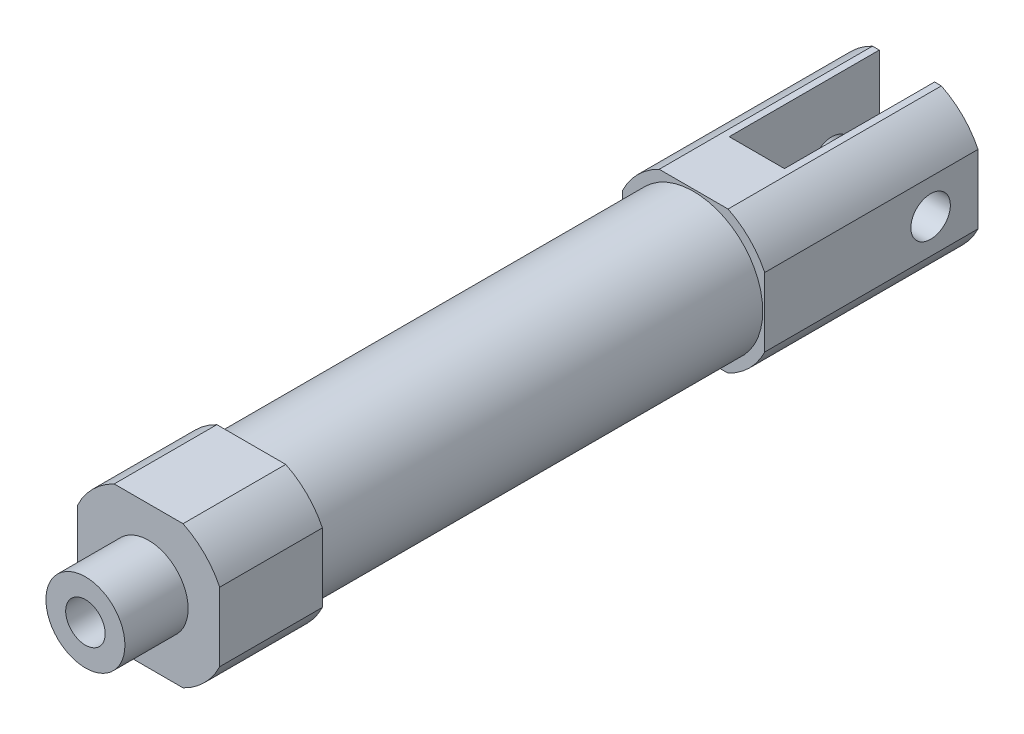
ISO-10303-21;
HEADER;
FILE_DESCRIPTION(('STEP AP214'),'2;1');
FILE_NAME('part.step','',(''),(''),'','','');
FILE_SCHEMA(('AUTOMOTIVE_DESIGN { 1 0 10303 214 1 1 1 1 }'));
ENDSEC;
DATA;
#1=APPLICATION_CONTEXT('core data for automotive mechanical design processes');
#2=APPLICATION_PROTOCOL_DEFINITION('international standard','automotive_design',2000,#1);
#3=PRODUCT_CONTEXT('',#1,'mechanical');
#4=PRODUCT('Part','Part','',(#3));
#5=PRODUCT_RELATED_PRODUCT_CATEGORY('part','',(#4));
#6=PRODUCT_DEFINITION_FORMATION('','',#4);
#7=PRODUCT_DEFINITION_CONTEXT('part definition',#1,'design');
#8=PRODUCT_DEFINITION('design','',#6,#7);
#9=PRODUCT_DEFINITION_SHAPE('','',#8);
#10=(LENGTH_UNIT() NAMED_UNIT(*) SI_UNIT(.MILLI.,.METRE.));
#11=(NAMED_UNIT(*) PLANE_ANGLE_UNIT() SI_UNIT($,.RADIAN.));
#12=(NAMED_UNIT(*) SI_UNIT($,.STERADIAN.) SOLID_ANGLE_UNIT());
#13=UNCERTAINTY_MEASURE_WITH_UNIT(LENGTH_MEASURE(1.E-05),#10,'distance_accuracy_value','');
#14=(GEOMETRIC_REPRESENTATION_CONTEXT(3) GLOBAL_UNCERTAINTY_ASSIGNED_CONTEXT((#13)) GLOBAL_UNIT_ASSIGNED_CONTEXT((#10,
#11,#12)) REPRESENTATION_CONTEXT('',''));
#15=CARTESIAN_POINT('',(0.,0.,0.));
#16=DIRECTION('',(0.,0.,1.));
#17=DIRECTION('',(1.,0.,0.));
#18=AXIS2_PLACEMENT_3D('',#15,#16,#17);
#19=CARTESIAN_POINT('',(0.,-22.1414213562373,0.));
#20=DIRECTION('',(0.,0.,1.));
#21=DIRECTION('',(1.,0.,0.));
#22=AXIS2_PLACEMENT_3D('',#19,#20,#21);
#23=PLANE('',#22);
#24=DIRECTION('',(1.,0.,0.));
#25=VECTOR('',#24,1.);
#26=CARTESIAN_POINT('',(0.,-9.,0.));
#27=LINE('',#26,#25);
#28=CARTESIAN_POINT('',(3.5,-9.,0.));
#29=VERTEX_POINT('',#28);
#30=CARTESIAN_POINT('',(4.35889894354066,-9.,0.));
#31=VERTEX_POINT('',#30);
#32=EDGE_CURVE('E168',#29,#31,#27,.T.);
#33=ORIENTED_EDGE('',*,*,#32,.F.);
#34=DIRECTION('',(0.,1.,0.));
#35=VECTOR('',#34,1.);
#36=CARTESIAN_POINT('',(3.5,-9.001,0.));
#37=LINE('',#36,#35);
#38=CARTESIAN_POINT('',(3.5,9.,0.));
#39=VERTEX_POINT('',#38);
#40=EDGE_CURVE('E192',#29,#39,#37,.T.);
#41=ORIENTED_EDGE('',*,*,#40,.T.);
#42=DIRECTION('',(1.,0.,0.));
#43=VECTOR('',#42,1.);
#44=CARTESIAN_POINT('',(0.,9.,0.));
#45=LINE('',#44,#43);
#46=CARTESIAN_POINT('',(4.35889894354067,9.,0.));
#47=VERTEX_POINT('',#46);
#48=EDGE_CURVE('E158',#39,#47,#45,.T.);
#49=ORIENTED_EDGE('',*,*,#48,.T.);
#50=CARTESIAN_POINT('',(0.,0.,0.));
#51=DIRECTION('',(0.,0.,1.));
#52=DIRECTION('',(1.,0.,0.));
#53=AXIS2_PLACEMENT_3D('',#50,#51,#52);
#54=CIRCLE('',#53,10.);
#55=CARTESIAN_POINT('',(9.,4.35889894354067,0.));
#56=VERTEX_POINT('',#55);
#57=EDGE_CURVE('E154',#56,#47,#54,.T.);
#58=ORIENTED_EDGE('',*,*,#57,.F.);
#59=DIRECTION('',(0.,1.,0.));
#60=VECTOR('',#59,1.);
#61=CARTESIAN_POINT('',(9.,-22.1414213562373,0.));
#62=LINE('',#61,#60);
#63=CARTESIAN_POINT('',(9.,-4.35889894354067,0.));
#64=VERTEX_POINT('',#63);
#65=EDGE_CURVE('E151',#64,#56,#62,.T.);
#66=ORIENTED_EDGE('',*,*,#65,.F.);
#67=EDGE_CURVE('E96',#31,#64,#54,.T.);
#68=ORIENTED_EDGE('',*,*,#67,.F.);
#69=EDGE_LOOP('',(#33,#41,#49,#58,#66,#68));
#70=FACE_BOUND('',#69,.T.);
#71=ADVANCED_FACE('F38',(#70),#23,.F.);
#72=CARTESIAN_POINT('',(0.,-22.1414213562373,96.));
#73=DIRECTION('',(0.,0.,1.));
#74=DIRECTION('',(1.,0.,0.));
#75=AXIS2_PLACEMENT_3D('',#72,#73,#74);
#76=PLANE('',#75);
#77=DIRECTION('',(0.,1.,0.));
#78=VECTOR('',#77,1.);
#79=CARTESIAN_POINT('',(9.00000000000001,-22.1414213562373,96.));
#80=LINE('',#79,#78);
#81=CARTESIAN_POINT('',(9.,-4.35889894354068,96.));
#82=VERTEX_POINT('',#81);
#83=CARTESIAN_POINT('',(9.,4.35889894354068,96.));
#84=VERTEX_POINT('',#83);
#85=EDGE_CURVE('E227',#82,#84,#80,.T.);
#86=ORIENTED_EDGE('',*,*,#85,.T.);
#87=CARTESIAN_POINT('',(0.,0.,96.));
#88=DIRECTION('',(0.,0.,1.));
#89=DIRECTION('',(1.,0.,0.));
#90=AXIS2_PLACEMENT_3D('',#87,#88,#89);
#91=CIRCLE('',#90,10.);
#92=CARTESIAN_POINT('',(4.35889894354068,9.,96.));
#93=VERTEX_POINT('',#92);
#94=EDGE_CURVE('E230',#84,#93,#91,.T.);
#95=ORIENTED_EDGE('',*,*,#94,.T.);
#96=DIRECTION('',(1.,0.,0.));
#97=VECTOR('',#96,1.);
#98=CARTESIAN_POINT('',(0.,9.,96.));
#99=LINE('',#98,#97);
#100=CARTESIAN_POINT('',(-4.35889894354068,9.,96.));
#101=VERTEX_POINT('',#100);
#102=EDGE_CURVE('E234',#101,#93,#99,.T.);
#103=ORIENTED_EDGE('',*,*,#102,.F.);
#104=CARTESIAN_POINT('',(-9.,4.35889894354068,96.));
#105=VERTEX_POINT('',#104);
#106=EDGE_CURVE('E236',#101,#105,#91,.T.);
#107=ORIENTED_EDGE('',*,*,#106,.T.);
#108=DIRECTION('',(0.,1.,0.));
#109=VECTOR('',#108,1.);
#110=CARTESIAN_POINT('',(-8.99999999999999,-22.1414213562373,96.));
#111=LINE('',#110,#109);
#112=CARTESIAN_POINT('',(-9.,-4.35889894354068,96.));
#113=VERTEX_POINT('',#112);
#114=EDGE_CURVE('E239',#113,#105,#111,.T.);
#115=ORIENTED_EDGE('',*,*,#114,.F.);
#116=CARTESIAN_POINT('',(-4.35889894354068,-9.,96.));
#117=VERTEX_POINT('',#116);
#118=EDGE_CURVE('E242',#113,#117,#91,.T.);
#119=ORIENTED_EDGE('',*,*,#118,.T.);
#120=DIRECTION('',(1.,0.,0.));
#121=VECTOR('',#120,1.);
#122=CARTESIAN_POINT('',(0.,-9.,96.));
#123=LINE('',#122,#121);
#124=CARTESIAN_POINT('',(4.35889894354068,-9.,96.));
#125=VERTEX_POINT('',#124);
#126=EDGE_CURVE('E243',#117,#125,#123,.T.);
#127=ORIENTED_EDGE('',*,*,#126,.T.);
#128=EDGE_CURVE('E235',#125,#82,#91,.T.);
#129=ORIENTED_EDGE('',*,*,#128,.T.);
#130=EDGE_LOOP('',(#86,#95,#103,#107,#115,#119,#127,#129));
#131=FACE_BOUND('',#130,.T.);
#132=CARTESIAN_POINT('',(0.,0.,96.));
#133=DIRECTION('',(0.,0.,1.));
#134=DIRECTION('',(1.,0.,0.));
#135=AXIS2_PLACEMENT_3D('',#132,#133,#134);
#136=CIRCLE('',#135,5.);
#137=CARTESIAN_POINT('',(5.,0.,96.));
#138=VERTEX_POINT('',#137);
#139=EDGE_CURVE('E219',#138,#138,#136,.T.);
#140=ORIENTED_EDGE('',*,*,#139,.F.);
#141=EDGE_LOOP('',(#140));
#142=FACE_BOUND('',#141,.T.);
#143=ADVANCED_FACE('F350',(#131,#142),#76,.T.);
#144=CARTESIAN_POINT('',(0.,-22.1414213562373,27.));
#145=DIRECTION('',(0.,0.,1.));
#146=DIRECTION('',(1.,0.,0.));
#147=AXIS2_PLACEMENT_3D('',#144,#145,#146);
#148=PLANE('',#147);
#149=DIRECTION('',(0.,1.,0.));
#150=VECTOR('',#149,1.);
#151=CARTESIAN_POINT('',(9.,-22.1414213562373,27.));
#152=LINE('',#151,#150);
#153=CARTESIAN_POINT('',(9.,-4.35889894354067,27.));
#154=VERTEX_POINT('',#153);
#155=CARTESIAN_POINT('',(9.,4.35889894354067,27.));
#156=VERTEX_POINT('',#155);
#157=EDGE_CURVE('E291',#154,#156,#152,.T.);
#158=ORIENTED_EDGE('',*,*,#157,.T.);
#159=CARTESIAN_POINT('',(0.,0.,27.));
#160=DIRECTION('',(0.,0.,1.));
#161=DIRECTION('',(1.,0.,0.));
#162=AXIS2_PLACEMENT_3D('',#159,#160,#161);
#163=CIRCLE('',#162,10.);
#164=CARTESIAN_POINT('',(4.35889894354067,9.,27.));
#165=VERTEX_POINT('',#164);
#166=EDGE_CURVE('E104',#156,#165,#163,.T.);
#167=ORIENTED_EDGE('',*,*,#166,.T.);
#168=DIRECTION('',(1.,0.,0.));
#169=VECTOR('',#168,1.);
#170=CARTESIAN_POINT('',(0.,9.,27.));
#171=LINE('',#170,#169);
#172=CARTESIAN_POINT('',(-4.35889894354067,9.,27.));
#173=VERTEX_POINT('',#172);
#174=EDGE_CURVE('E184',#173,#165,#171,.T.);
#175=ORIENTED_EDGE('',*,*,#174,.F.);
#176=CARTESIAN_POINT('',(-9.,4.35889894354067,27.));
#177=VERTEX_POINT('',#176);
#178=EDGE_CURVE('E132',#173,#177,#163,.T.);
#179=ORIENTED_EDGE('',*,*,#178,.T.);
#180=DIRECTION('',(0.,1.,0.));
#181=VECTOR('',#180,1.);
#182=CARTESIAN_POINT('',(-8.99999999999999,-22.1414213562373,27.));
#183=LINE('',#182,#181);
#184=CARTESIAN_POINT('',(-9.,-4.35889894354067,27.));
#185=VERTEX_POINT('',#184);
#186=EDGE_CURVE('E129',#185,#177,#183,.T.);
#187=ORIENTED_EDGE('',*,*,#186,.F.);
#188=CARTESIAN_POINT('',(-4.35889894354067,-9.,27.));
#189=VERTEX_POINT('',#188);
#190=EDGE_CURVE('E121',#185,#189,#163,.T.);
#191=ORIENTED_EDGE('',*,*,#190,.T.);
#192=DIRECTION('',(1.,0.,0.));
#193=VECTOR('',#192,1.);
#194=CARTESIAN_POINT('',(0.,-9.,27.));
#195=LINE('',#194,#193);
#196=CARTESIAN_POINT('',(4.35889894354066,-9.,27.));
#197=VERTEX_POINT('',#196);
#198=EDGE_CURVE('E126',#189,#197,#195,.T.);
#199=ORIENTED_EDGE('',*,*,#198,.T.);
#200=EDGE_CURVE('E63',#197,#154,#163,.T.);
#201=ORIENTED_EDGE('',*,*,#200,.T.);
#202=EDGE_LOOP('',(#158,#167,#175,#179,#187,#191,#199,#201));
#203=FACE_BOUND('',#202,.T.);
#204=CARTESIAN_POINT('',(0.,0.,27.));
#205=DIRECTION('',(0.,0.,1.));
#206=DIRECTION('',(1.,0.,0.));
#207=AXIS2_PLACEMENT_3D('',#204,#205,#206);
#208=CIRCLE('',#207,8.75);
#209=CARTESIAN_POINT('',(8.75,0.,27.));
#210=VERTEX_POINT('',#209);
#211=EDGE_CURVE('E286',#210,#210,#208,.T.);
#212=ORIENTED_EDGE('',*,*,#211,.F.);
#213=EDGE_LOOP('',(#212));
#214=FACE_BOUND('',#213,.T.);
#215=ADVANCED_FACE('F123',(#203,#214),#148,.T.);
#216=CARTESIAN_POINT('',(9.,-22.1414213562373,27.));
#217=DIRECTION('',(-1.,0.,0.));
#218=DIRECTION('',(0.,0.,1.));
#219=AXIS2_PLACEMENT_3D('',#216,#217,#218);
#220=PLANE('',#219);
#221=CARTESIAN_POINT('',(9.,0.,6.));
#222=DIRECTION('',(-1.,0.,0.));
#223=DIRECTION('',(0.,-1.,0.));
#224=AXIS2_PLACEMENT_3D('',#221,#222,#223);
#225=CIRCLE('',#224,2.5);
#226=CARTESIAN_POINT('',(9.,-2.49999999999999,6.));
#227=VERTEX_POINT('',#226);
#228=EDGE_CURVE('E327',#227,#227,#225,.T.);
#229=ORIENTED_EDGE('',*,*,#228,.T.);
#230=EDGE_LOOP('',(#229));
#231=FACE_BOUND('',#230,.T.);
#232=ORIENTED_EDGE('',*,*,#65,.T.);
#233=DIRECTION('',(0.,0.,-1.));
#234=VECTOR('',#233,1.);
#235=CARTESIAN_POINT('',(9.,4.35889894354067,27.));
#236=LINE('',#235,#234);
#237=EDGE_CURVE('E11',#156,#56,#236,.T.);
#238=ORIENTED_EDGE('',*,*,#237,.F.);
#239=ORIENTED_EDGE('',*,*,#157,.F.);
#240=DIRECTION('',(0.,0.,-1.));
#241=VECTOR('',#240,1.);
#242=CARTESIAN_POINT('',(9.,-4.35889894354067,27.));
#243=LINE('',#242,#241);
#244=EDGE_CURVE('E147',#154,#64,#243,.T.);
#245=ORIENTED_EDGE('',*,*,#244,.T.);
#246=EDGE_LOOP('',(#232,#238,#239,#245));
#247=FACE_BOUND('',#246,.T.);
#248=ADVANCED_FACE('F40',(#231,#247),#220,.F.);
#249=CARTESIAN_POINT('',(0.,0.,27.));
#250=DIRECTION('',(0.,0.,-1.));
#251=DIRECTION('',(-1.,0.,0.));
#252=AXIS2_PLACEMENT_3D('',#249,#250,#251);
#253=CYLINDRICAL_SURFACE('',#252,10.);
#254=ORIENTED_EDGE('',*,*,#57,.T.);
#255=DIRECTION('',(0.,0.,-1.));
#256=VECTOR('',#255,1.);
#257=CARTESIAN_POINT('',(4.35889894354067,9.,27.));
#258=LINE('',#257,#256);
#259=EDGE_CURVE('E47',#165,#47,#258,.T.);
#260=ORIENTED_EDGE('',*,*,#259,.F.);
#261=ORIENTED_EDGE('',*,*,#166,.F.);
#262=ORIENTED_EDGE('',*,*,#237,.T.);
#263=EDGE_LOOP('',(#254,#260,#261,#262));
#264=FACE_BOUND('',#263,.T.);
#265=ADVANCED_FACE('F185',(#264),#253,.T.);
#266=CARTESIAN_POINT('',(0.,9.,27.));
#267=DIRECTION('',(0.,1.,0.));
#268=DIRECTION('',(0.,0.,1.));
#269=AXIS2_PLACEMENT_3D('',#266,#267,#268);
#270=PLANE('',#269);
#271=DIRECTION('',(0.,0.,-1.));
#272=VECTOR('',#271,1.);
#273=CARTESIAN_POINT('',(3.5,9.,19.));
#274=LINE('',#273,#272);
#275=CARTESIAN_POINT('',(3.5,9.,19.));
#276=VERTEX_POINT('',#275);
#277=EDGE_CURVE('E211',#276,#39,#274,.T.);
#278=ORIENTED_EDGE('',*,*,#277,.F.);
#279=DIRECTION('',(1.,0.,0.));
#280=VECTOR('',#279,1.);
#281=CARTESIAN_POINT('',(-3.5,9.,19.));
#282=LINE('',#281,#280);
#283=CARTESIAN_POINT('',(-3.5,9.,19.));
#284=VERTEX_POINT('',#283);
#285=EDGE_CURVE('E311',#284,#276,#282,.T.);
#286=ORIENTED_EDGE('',*,*,#285,.F.);
#287=DIRECTION('',(0.,0.,1.));
#288=VECTOR('',#287,1.);
#289=CARTESIAN_POINT('',(-3.5,9.,0.));
#290=LINE('',#289,#288);
#291=CARTESIAN_POINT('',(-3.5,9.,0.));
#292=VERTEX_POINT('',#291);
#293=EDGE_CURVE('E308',#292,#284,#290,.T.);
#294=ORIENTED_EDGE('',*,*,#293,.F.);
#295=CARTESIAN_POINT('',(-4.35889894354067,9.,0.));
#296=VERTEX_POINT('',#295);
#297=EDGE_CURVE('E160',#296,#292,#45,.T.);
#298=ORIENTED_EDGE('',*,*,#297,.F.);
#299=DIRECTION('',(0.,0.,-1.));
#300=VECTOR('',#299,1.);
#301=CARTESIAN_POINT('',(-4.35889894354067,9.,27.));
#302=LINE('',#301,#300);
#303=EDGE_CURVE('E174',#173,#296,#302,.T.);
#304=ORIENTED_EDGE('',*,*,#303,.F.);
#305=ORIENTED_EDGE('',*,*,#174,.T.);
#306=ORIENTED_EDGE('',*,*,#259,.T.);
#307=ORIENTED_EDGE('',*,*,#48,.F.);
#308=EDGE_LOOP('',(#278,#286,#294,#298,#304,#305,#306,#307));
#309=FACE_BOUND('',#308,.T.);
#310=ADVANCED_FACE('F181',(#309),#270,.T.);
#311=CARTESIAN_POINT('',(-9.,4.35889894354067,0.));
#312=VERTEX_POINT('',#311);
#313=EDGE_CURVE('E159',#296,#312,#54,.T.);
#314=ORIENTED_EDGE('',*,*,#313,.T.);
#315=DIRECTION('',(0.,0.,-1.));
#316=VECTOR('',#315,1.);
#317=CARTESIAN_POINT('',(-9.,4.35889894354067,27.));
#318=LINE('',#317,#316);
#319=EDGE_CURVE('E172',#177,#312,#318,.T.);
#320=ORIENTED_EDGE('',*,*,#319,.F.);
#321=ORIENTED_EDGE('',*,*,#178,.F.);
#322=ORIENTED_EDGE('',*,*,#303,.T.);
#323=EDGE_LOOP('',(#314,#320,#321,#322));
#324=FACE_BOUND('',#323,.T.);
#325=ADVANCED_FACE('F302',(#324),#253,.T.);
#326=CARTESIAN_POINT('',(-8.99999999999999,-22.1414213562373,27.));
#327=DIRECTION('',(-1.,0.,0.));
#328=DIRECTION('',(0.,-1.,0.));
#329=AXIS2_PLACEMENT_3D('',#326,#327,#328);
#330=PLANE('',#329);
#331=CARTESIAN_POINT('',(-9.,0.,6.));
#332=DIRECTION('',(-1.,0.,0.));
#333=DIRECTION('',(0.,-1.,0.));
#334=AXIS2_PLACEMENT_3D('',#331,#332,#333);
#335=CIRCLE('',#334,2.5);
#336=CARTESIAN_POINT('',(-9.,-2.5,6.));
#337=VERTEX_POINT('',#336);
#338=EDGE_CURVE('E324',#337,#337,#335,.T.);
#339=ORIENTED_EDGE('',*,*,#338,.F.);
#340=EDGE_LOOP('',(#339));
#341=FACE_BOUND('',#340,.T.);
#342=DIRECTION('',(0.,1.,0.));
#343=VECTOR('',#342,1.);
#344=CARTESIAN_POINT('',(-8.99999999999999,-22.1414213562373,0.));
#345=LINE('',#344,#343);
#346=CARTESIAN_POINT('',(-9.,-4.35889894354067,0.));
#347=VERTEX_POINT('',#346);
#348=EDGE_CURVE('E163',#347,#312,#345,.T.);
#349=ORIENTED_EDGE('',*,*,#348,.F.);
#350=DIRECTION('',(0.,0.,-1.));
#351=VECTOR('',#350,1.);
#352=CARTESIAN_POINT('',(-9.,-4.35889894354067,27.));
#353=LINE('',#352,#351);
#354=EDGE_CURVE('E141',#185,#347,#353,.T.);
#355=ORIENTED_EDGE('',*,*,#354,.F.);
#356=ORIENTED_EDGE('',*,*,#186,.T.);
#357=ORIENTED_EDGE('',*,*,#319,.T.);
#358=EDGE_LOOP('',(#349,#355,#356,#357));
#359=FACE_BOUND('',#358,.T.);
#360=ADVANCED_FACE('F296',(#341,#359),#330,.T.);
#361=CARTESIAN_POINT('',(-4.35889894354067,-9.,0.));
#362=VERTEX_POINT('',#361);
#363=EDGE_CURVE('E137',#347,#362,#54,.T.);
#364=ORIENTED_EDGE('',*,*,#363,.T.);
#365=DIRECTION('',(0.,0.,-1.));
#366=VECTOR('',#365,1.);
#367=CARTESIAN_POINT('',(-4.35889894354067,-9.,27.));
#368=LINE('',#367,#366);
#369=EDGE_CURVE('E134',#189,#362,#368,.T.);
#370=ORIENTED_EDGE('',*,*,#369,.F.);
#371=ORIENTED_EDGE('',*,*,#190,.F.);
#372=ORIENTED_EDGE('',*,*,#354,.T.);
#373=EDGE_LOOP('',(#364,#370,#371,#372));
#374=FACE_BOUND('',#373,.T.);
#375=ADVANCED_FACE('F135',(#374),#253,.T.);
#376=CARTESIAN_POINT('',(0.,-9.,27.));
#377=DIRECTION('',(0.,1.,0.));
#378=DIRECTION('',(0.,0.,1.));
#379=AXIS2_PLACEMENT_3D('',#376,#377,#378);
#380=PLANE('',#379);
#381=DIRECTION('',(-1.,0.,0.));
#382=VECTOR('',#381,1.);
#383=CARTESIAN_POINT('',(-3.5,-9.,19.));
#384=LINE('',#383,#382);
#385=CARTESIAN_POINT('',(3.5,-9.,19.));
#386=VERTEX_POINT('',#385);
#387=CARTESIAN_POINT('',(-3.5,-9.,19.));
#388=VERTEX_POINT('',#387);
#389=EDGE_CURVE('E315',#386,#388,#384,.T.);
#390=ORIENTED_EDGE('',*,*,#389,.F.);
#391=DIRECTION('',(0.,0.,1.));
#392=VECTOR('',#391,1.);
#393=CARTESIAN_POINT('',(3.5,-9.,19.));
#394=LINE('',#393,#392);
#395=EDGE_CURVE('E313',#29,#386,#394,.T.);
#396=ORIENTED_EDGE('',*,*,#395,.F.);
#397=ORIENTED_EDGE('',*,*,#32,.T.);
#398=DIRECTION('',(0.,0.,-1.));
#399=VECTOR('',#398,1.);
#400=CARTESIAN_POINT('',(4.35889894354066,-9.,27.));
#401=LINE('',#400,#399);
#402=EDGE_CURVE('E142',#197,#31,#401,.T.);
#403=ORIENTED_EDGE('',*,*,#402,.F.);
#404=ORIENTED_EDGE('',*,*,#198,.F.);
#405=ORIENTED_EDGE('',*,*,#369,.T.);
#406=CARTESIAN_POINT('',(-3.5,-9.,0.));
#407=VERTEX_POINT('',#406);
#408=EDGE_CURVE('E166',#362,#407,#27,.T.);
#409=ORIENTED_EDGE('',*,*,#408,.T.);
#410=DIRECTION('',(0.,0.,-1.));
#411=VECTOR('',#410,1.);
#412=CARTESIAN_POINT('',(-3.5,-9.,0.));
#413=LINE('',#412,#411);
#414=EDGE_CURVE('E54',#388,#407,#413,.T.);
#415=ORIENTED_EDGE('',*,*,#414,.F.);
#416=EDGE_LOOP('',(#390,#396,#397,#403,#404,#405,#409,#415));
#417=FACE_BOUND('',#416,.T.);
#418=ADVANCED_FACE('F145',(#417),#380,.F.);
#419=ORIENTED_EDGE('',*,*,#67,.T.);
#420=ORIENTED_EDGE('',*,*,#244,.F.);
#421=ORIENTED_EDGE('',*,*,#200,.F.);
#422=ORIENTED_EDGE('',*,*,#402,.T.);
#423=EDGE_LOOP('',(#419,#420,#421,#422));
#424=FACE_BOUND('',#423,.T.);
#425=ADVANCED_FACE('F361',(#424),#253,.T.);
#426=ORIENTED_EDGE('',*,*,#297,.T.);
#427=DIRECTION('',(0.,1.,0.));
#428=VECTOR('',#427,1.);
#429=CARTESIAN_POINT('',(-3.5,-9.001,0.));
#430=LINE('',#429,#428);
#431=EDGE_CURVE('E216',#407,#292,#430,.T.);
#432=ORIENTED_EDGE('',*,*,#431,.F.);
#433=ORIENTED_EDGE('',*,*,#408,.F.);
#434=ORIENTED_EDGE('',*,*,#363,.F.);
#435=ORIENTED_EDGE('',*,*,#348,.T.);
#436=ORIENTED_EDGE('',*,*,#313,.F.);
#437=EDGE_LOOP('',(#426,#432,#433,#434,#435,#436));
#438=FACE_BOUND('',#437,.T.);
#439=ADVANCED_FACE('F299',(#438),#23,.F.);
#440=CARTESIAN_POINT('',(0.,0.,83.));
#441=DIRECTION('',(0.,0.,-1.));
#442=DIRECTION('',(-1.,0.,0.));
#443=AXIS2_PLACEMENT_3D('',#440,#441,#442);
#444=CYLINDRICAL_SURFACE('',#443,8.75);
#445=CARTESIAN_POINT('',(0.,0.,83.));
#446=DIRECTION('',(0.,0.,1.));
#447=DIRECTION('',(1.,0.,0.));
#448=AXIS2_PLACEMENT_3D('',#445,#446,#447);
#449=CIRCLE('',#448,8.75);
#450=CARTESIAN_POINT('',(8.75,0.,83.));
#451=VERTEX_POINT('',#450);
#452=EDGE_CURVE('E155',#451,#451,#449,.T.);
#453=ORIENTED_EDGE('',*,*,#452,.F.);
#454=EDGE_LOOP('',(#453));
#455=FACE_BOUND('',#454,.T.);
#456=ORIENTED_EDGE('',*,*,#211,.T.);
#457=EDGE_LOOP('',(#456));
#458=FACE_BOUND('',#457,.T.);
#459=ADVANCED_FACE('F360',(#455,#458),#444,.T.);
#460=CARTESIAN_POINT('',(0.,-22.1414213562373,83.));
#461=DIRECTION('',(0.,0.,1.));
#462=DIRECTION('',(1.,0.,0.));
#463=AXIS2_PLACEMENT_3D('',#460,#461,#462);
#464=PLANE('',#463);
#465=DIRECTION('',(0.,1.,0.));
#466=VECTOR('',#465,1.);
#467=CARTESIAN_POINT('',(9.00000000000001,-22.1414213562373,83.));
#468=LINE('',#467,#466);
#469=CARTESIAN_POINT('',(9.,-4.35889894354068,83.));
#470=VERTEX_POINT('',#469);
#471=CARTESIAN_POINT('',(9.,4.35889894354068,83.));
#472=VERTEX_POINT('',#471);
#473=EDGE_CURVE('E224',#470,#472,#468,.T.);
#474=ORIENTED_EDGE('',*,*,#473,.F.);
#475=CARTESIAN_POINT('',(0.,0.,83.));
#476=DIRECTION('',(0.,0.,1.));
#477=DIRECTION('',(1.,0.,0.));
#478=AXIS2_PLACEMENT_3D('',#475,#476,#477);
#479=CIRCLE('',#478,10.);
#480=CARTESIAN_POINT('',(4.35889894354068,-9.,83.));
#481=VERTEX_POINT('',#480);
#482=EDGE_CURVE('E231',#481,#470,#479,.T.);
#483=ORIENTED_EDGE('',*,*,#482,.F.);
#484=DIRECTION('',(1.,0.,0.));
#485=VECTOR('',#484,1.);
#486=CARTESIAN_POINT('',(0.,-9.,83.));
#487=LINE('',#486,#485);
#488=CARTESIAN_POINT('',(-4.35889894354068,-9.,83.));
#489=VERTEX_POINT('',#488);
#490=EDGE_CURVE('E259',#489,#481,#487,.T.);
#491=ORIENTED_EDGE('',*,*,#490,.F.);
#492=CARTESIAN_POINT('',(-9.,-4.35889894354068,83.));
#493=VERTEX_POINT('',#492);
#494=EDGE_CURVE('E258',#493,#489,#479,.T.);
#495=ORIENTED_EDGE('',*,*,#494,.F.);
#496=DIRECTION('',(0.,1.,0.));
#497=VECTOR('',#496,1.);
#498=CARTESIAN_POINT('',(-8.99999999999999,-22.1414213562373,83.));
#499=LINE('',#498,#497);
#500=CARTESIAN_POINT('',(-9.,4.35889894354068,83.));
#501=VERTEX_POINT('',#500);
#502=EDGE_CURVE('E255',#493,#501,#499,.T.);
#503=ORIENTED_EDGE('',*,*,#502,.T.);
#504=CARTESIAN_POINT('',(-4.35889894354068,9.,83.));
#505=VERTEX_POINT('',#504);
#506=EDGE_CURVE('E252',#505,#501,#479,.T.);
#507=ORIENTED_EDGE('',*,*,#506,.F.);
#508=DIRECTION('',(1.,0.,0.));
#509=VECTOR('',#508,1.);
#510=CARTESIAN_POINT('',(0.,9.,83.));
#511=LINE('',#510,#509);
#512=CARTESIAN_POINT('',(4.35889894354068,9.,83.));
#513=VERTEX_POINT('',#512);
#514=EDGE_CURVE('E251',#505,#513,#511,.T.);
#515=ORIENTED_EDGE('',*,*,#514,.T.);
#516=EDGE_CURVE('E248',#472,#513,#479,.T.);
#517=ORIENTED_EDGE('',*,*,#516,.F.);
#518=EDGE_LOOP('',(#474,#483,#491,#495,#503,#507,#515,#517));
#519=FACE_BOUND('',#518,.T.);
#520=ORIENTED_EDGE('',*,*,#452,.T.);
#521=EDGE_LOOP('',(#520));
#522=FACE_BOUND('',#521,.T.);
#523=ADVANCED_FACE('F366',(#519,#522),#464,.F.);
#524=CARTESIAN_POINT('',(9.00000000000001,-22.1414213562373,96.));
#525=DIRECTION('',(-1.,0.,0.));
#526=DIRECTION('',(0.,-1.,0.));
#527=AXIS2_PLACEMENT_3D('',#524,#525,#526);
#528=PLANE('',#527);
#529=ORIENTED_EDGE('',*,*,#473,.T.);
#530=DIRECTION('',(0.,0.,-1.));
#531=VECTOR('',#530,1.);
#532=CARTESIAN_POINT('',(9.,4.35889894354068,96.));
#533=LINE('',#532,#531);
#534=EDGE_CURVE('E283',#84,#472,#533,.T.);
#535=ORIENTED_EDGE('',*,*,#534,.F.);
#536=ORIENTED_EDGE('',*,*,#85,.F.);
#537=DIRECTION('',(0.,0.,-1.));
#538=VECTOR('',#537,1.);
#539=CARTESIAN_POINT('',(9.,-4.35889894354068,96.));
#540=LINE('',#539,#538);
#541=EDGE_CURVE('E262',#82,#470,#540,.T.);
#542=ORIENTED_EDGE('',*,*,#541,.T.);
#543=EDGE_LOOP('',(#529,#535,#536,#542));
#544=FACE_BOUND('',#543,.T.);
#545=ADVANCED_FACE('F540',(#544),#528,.F.);
#546=CARTESIAN_POINT('',(0.,0.,96.));
#547=DIRECTION('',(0.,0.,-1.));
#548=DIRECTION('',(-1.,0.,0.));
#549=AXIS2_PLACEMENT_3D('',#546,#547,#548);
#550=CYLINDRICAL_SURFACE('',#549,10.);
#551=ORIENTED_EDGE('',*,*,#516,.T.);
#552=DIRECTION('',(0.,0.,-1.));
#553=VECTOR('',#552,1.);
#554=CARTESIAN_POINT('',(4.35889894354068,9.,96.));
#555=LINE('',#554,#553);
#556=EDGE_CURVE('E280',#93,#513,#555,.T.);
#557=ORIENTED_EDGE('',*,*,#556,.F.);
#558=ORIENTED_EDGE('',*,*,#94,.F.);
#559=ORIENTED_EDGE('',*,*,#534,.T.);
#560=EDGE_LOOP('',(#551,#557,#558,#559));
#561=FACE_BOUND('',#560,.T.);
#562=ADVANCED_FACE('F549',(#561),#550,.T.);
#563=CARTESIAN_POINT('',(0.,9.,96.));
#564=DIRECTION('',(0.,1.,0.));
#565=DIRECTION('',(-1.,0.,0.));
#566=AXIS2_PLACEMENT_3D('',#563,#564,#565);
#567=PLANE('',#566);
#568=ORIENTED_EDGE('',*,*,#514,.F.);
#569=DIRECTION('',(0.,0.,-1.));
#570=VECTOR('',#569,1.);
#571=CARTESIAN_POINT('',(-4.35889894354068,9.,96.));
#572=LINE('',#571,#570);
#573=EDGE_CURVE('E277',#101,#505,#572,.T.);
#574=ORIENTED_EDGE('',*,*,#573,.F.);
#575=ORIENTED_EDGE('',*,*,#102,.T.);
#576=ORIENTED_EDGE('',*,*,#556,.T.);
#577=EDGE_LOOP('',(#568,#574,#575,#576));
#578=FACE_BOUND('',#577,.T.);
#579=ADVANCED_FACE('F558',(#578),#567,.T.);
#580=ORIENTED_EDGE('',*,*,#506,.T.);
#581=DIRECTION('',(0.,0.,-1.));
#582=VECTOR('',#581,1.);
#583=CARTESIAN_POINT('',(-9.,4.35889894354068,96.));
#584=LINE('',#583,#582);
#585=EDGE_CURVE('E274',#105,#501,#584,.T.);
#586=ORIENTED_EDGE('',*,*,#585,.F.);
#587=ORIENTED_EDGE('',*,*,#106,.F.);
#588=ORIENTED_EDGE('',*,*,#573,.T.);
#589=EDGE_LOOP('',(#580,#586,#587,#588));
#590=FACE_BOUND('',#589,.T.);
#591=ADVANCED_FACE('F561',(#590),#550,.T.);
#592=CARTESIAN_POINT('',(-8.99999999999999,-22.1414213562373,96.));
#593=DIRECTION('',(-1.,0.,0.));
#594=DIRECTION('',(0.,-1.,0.));
#595=AXIS2_PLACEMENT_3D('',#592,#593,#594);
#596=PLANE('',#595);
#597=ORIENTED_EDGE('',*,*,#502,.F.);
#598=DIRECTION('',(0.,0.,-1.));
#599=VECTOR('',#598,1.);
#600=CARTESIAN_POINT('',(-9.,-4.35889894354068,96.));
#601=LINE('',#600,#599);
#602=EDGE_CURVE('E271',#113,#493,#601,.T.);
#603=ORIENTED_EDGE('',*,*,#602,.F.);
#604=ORIENTED_EDGE('',*,*,#114,.T.);
#605=ORIENTED_EDGE('',*,*,#585,.T.);
#606=EDGE_LOOP('',(#597,#603,#604,#605));
#607=FACE_BOUND('',#606,.T.);
#608=ADVANCED_FACE('F576',(#607),#596,.T.);
#609=ORIENTED_EDGE('',*,*,#494,.T.);
#610=DIRECTION('',(0.,0.,-1.));
#611=VECTOR('',#610,1.);
#612=CARTESIAN_POINT('',(-4.35889894354068,-9.,96.));
#613=LINE('',#612,#611);
#614=EDGE_CURVE('E268',#117,#489,#613,.T.);
#615=ORIENTED_EDGE('',*,*,#614,.F.);
#616=ORIENTED_EDGE('',*,*,#118,.F.);
#617=ORIENTED_EDGE('',*,*,#602,.T.);
#618=EDGE_LOOP('',(#609,#615,#616,#617));
#619=FACE_BOUND('',#618,.T.);
#620=ADVANCED_FACE('F578',(#619),#550,.T.);
#621=CARTESIAN_POINT('',(0.,-9.,96.));
#622=DIRECTION('',(0.,1.,0.));
#623=DIRECTION('',(0.,0.,1.));
#624=AXIS2_PLACEMENT_3D('',#621,#622,#623);
#625=PLANE('',#624);
#626=ORIENTED_EDGE('',*,*,#490,.T.);
#627=DIRECTION('',(0.,0.,-1.));
#628=VECTOR('',#627,1.);
#629=CARTESIAN_POINT('',(4.35889894354068,-9.,96.));
#630=LINE('',#629,#628);
#631=EDGE_CURVE('E265',#125,#481,#630,.T.);
#632=ORIENTED_EDGE('',*,*,#631,.F.);
#633=ORIENTED_EDGE('',*,*,#126,.F.);
#634=ORIENTED_EDGE('',*,*,#614,.T.);
#635=EDGE_LOOP('',(#626,#632,#633,#634));
#636=FACE_BOUND('',#635,.T.);
#637=ADVANCED_FACE('F593',(#636),#625,.F.);
#638=ORIENTED_EDGE('',*,*,#482,.T.);
#639=ORIENTED_EDGE('',*,*,#541,.F.);
#640=ORIENTED_EDGE('',*,*,#128,.F.);
#641=ORIENTED_EDGE('',*,*,#631,.T.);
#642=EDGE_LOOP('',(#638,#639,#640,#641));
#643=FACE_BOUND('',#642,.T.);
#644=ADVANCED_FACE('F416',(#643),#550,.T.);
#645=CARTESIAN_POINT('',(0.,0.,104.));
#646=DIRECTION('',(0.,0.,-1.));
#647=DIRECTION('',(-1.,0.,0.));
#648=AXIS2_PLACEMENT_3D('',#645,#646,#647);
#649=CYLINDRICAL_SURFACE('',#648,5.);
#650=CARTESIAN_POINT('',(0.,0.,104.));
#651=DIRECTION('',(0.,0.,1.));
#652=DIRECTION('',(1.,0.,0.));
#653=AXIS2_PLACEMENT_3D('',#650,#651,#652);
#654=CIRCLE('',#653,5.);
#655=CARTESIAN_POINT('',(5.,0.,104.));
#656=VERTEX_POINT('',#655);
#657=EDGE_CURVE('E221',#656,#656,#654,.T.);
#658=ORIENTED_EDGE('',*,*,#657,.F.);
#659=EDGE_LOOP('',(#658));
#660=FACE_BOUND('',#659,.T.);
#661=ORIENTED_EDGE('',*,*,#139,.T.);
#662=EDGE_LOOP('',(#661));
#663=FACE_BOUND('',#662,.T.);
#664=ADVANCED_FACE('F420',(#660,#663),#649,.T.);
#665=CARTESIAN_POINT('',(0.,0.,104.));
#666=DIRECTION('',(0.,0.,1.));
#667=DIRECTION('',(1.,0.,0.));
#668=AXIS2_PLACEMENT_3D('',#665,#666,#667);
#669=PLANE('',#668);
#670=CARTESIAN_POINT('',(0.,0.,104.));
#671=DIRECTION('',(0.,0.,1.));
#672=DIRECTION('',(1.,0.,0.));
#673=AXIS2_PLACEMENT_3D('',#670,#671,#672);
#674=CIRCLE('',#673,2.5);
#675=CARTESIAN_POINT('',(2.5,0.,104.));
#676=VERTEX_POINT('',#675);
#677=EDGE_CURVE('E201',#676,#676,#674,.T.);
#678=ORIENTED_EDGE('',*,*,#677,.F.);
#679=EDGE_LOOP('',(#678));
#680=FACE_BOUND('',#679,.T.);
#681=ORIENTED_EDGE('',*,*,#657,.T.);
#682=EDGE_LOOP('',(#681));
#683=FACE_BOUND('',#682,.T.);
#684=ADVANCED_FACE('F424',(#680,#683),#669,.T.);
#685=CARTESIAN_POINT('',(0.,0.,74.));
#686=DIRECTION('',(0.,0.,1.));
#687=DIRECTION('',(1.,0.,0.));
#688=AXIS2_PLACEMENT_3D('',#685,#686,#687);
#689=CYLINDRICAL_SURFACE('',#688,2.5);
#690=CARTESIAN_POINT('',(0.,0.,74.));
#691=DIRECTION('',(0.,0.,1.));
#692=DIRECTION('',(1.,0.,0.));
#693=AXIS2_PLACEMENT_3D('',#690,#691,#692);
#694=CIRCLE('',#693,2.5);
#695=CARTESIAN_POINT('',(2.5,0.,74.));
#696=VERTEX_POINT('',#695);
#697=EDGE_CURVE('E205',#696,#696,#694,.T.);
#698=ORIENTED_EDGE('',*,*,#697,.F.);
#699=EDGE_LOOP('',(#698));
#700=FACE_BOUND('',#699,.T.);
#701=ORIENTED_EDGE('',*,*,#677,.T.);
#702=EDGE_LOOP('',(#701));
#703=FACE_BOUND('',#702,.T.);
#704=ADVANCED_FACE('F434',(#700,#703),#689,.F.);
#705=CARTESIAN_POINT('',(0.,0.,74.));
#706=DIRECTION('',(0.,0.,1.));
#707=DIRECTION('',(1.,0.,0.));
#708=AXIS2_PLACEMENT_3D('',#705,#706,#707);
#709=PLANE('',#708);
#710=ORIENTED_EDGE('',*,*,#697,.T.);
#711=EDGE_LOOP('',(#710));
#712=FACE_BOUND('',#711,.T.);
#713=ADVANCED_FACE('F444',(#712),#709,.T.);
#714=CARTESIAN_POINT('',(3.5,-9.001,19.));
#715=DIRECTION('',(1.,0.,0.));
#716=DIRECTION('',(0.,0.,-1.));
#717=AXIS2_PLACEMENT_3D('',#714,#715,#716);
#718=PLANE('',#717);
#719=CARTESIAN_POINT('',(3.5,0.,6.));
#720=DIRECTION('',(1.,0.,0.));
#721=DIRECTION('',(0.,0.,-1.));
#722=AXIS2_PLACEMENT_3D('',#719,#720,#721);
#723=CIRCLE('',#722,2.5);
#724=CARTESIAN_POINT('',(3.5,0.,3.5));
#725=VERTEX_POINT('',#724);
#726=EDGE_CURVE('E321',#725,#725,#723,.T.);
#727=ORIENTED_EDGE('',*,*,#726,.T.);
#728=EDGE_LOOP('',(#727));
#729=FACE_BOUND('',#728,.T.);
#730=ORIENTED_EDGE('',*,*,#395,.T.);
#731=DIRECTION('',(0.,1.,0.));
#732=VECTOR('',#731,1.);
#733=CARTESIAN_POINT('',(3.5,-9.001,19.));
#734=LINE('',#733,#732);
#735=EDGE_CURVE('E202',#386,#276,#734,.T.);
#736=ORIENTED_EDGE('',*,*,#735,.T.);
#737=ORIENTED_EDGE('',*,*,#277,.T.);
#738=ORIENTED_EDGE('',*,*,#40,.F.);
#739=EDGE_LOOP('',(#730,#736,#737,#738));
#740=FACE_BOUND('',#739,.T.);
#741=ADVANCED_FACE('F453',(#729,#740),#718,.F.);
#742=CARTESIAN_POINT('',(-3.5,-9.001,19.));
#743=DIRECTION('',(0.,0.,1.));
#744=DIRECTION('',(1.,0.,0.));
#745=AXIS2_PLACEMENT_3D('',#742,#743,#744);
#746=PLANE('',#745);
#747=ORIENTED_EDGE('',*,*,#389,.T.);
#748=DIRECTION('',(0.,1.,0.));
#749=VECTOR('',#748,1.);
#750=CARTESIAN_POINT('',(-3.5,-9.001,19.));
#751=LINE('',#750,#749);
#752=EDGE_CURVE('E208',#388,#284,#751,.T.);
#753=ORIENTED_EDGE('',*,*,#752,.T.);
#754=ORIENTED_EDGE('',*,*,#285,.T.);
#755=ORIENTED_EDGE('',*,*,#735,.F.);
#756=EDGE_LOOP('',(#747,#753,#754,#755));
#757=FACE_BOUND('',#756,.T.);
#758=ADVANCED_FACE('F346',(#757),#746,.F.);
#759=CARTESIAN_POINT('',(-3.5,-9.001,0.));
#760=DIRECTION('',(-1.,0.,0.));
#761=DIRECTION('',(0.,0.,1.));
#762=AXIS2_PLACEMENT_3D('',#759,#760,#761);
#763=PLANE('',#762);
#764=CARTESIAN_POINT('',(-3.5,0.,6.));
#765=DIRECTION('',(-1.,0.,0.));
#766=DIRECTION('',(0.,0.,1.));
#767=AXIS2_PLACEMENT_3D('',#764,#765,#766);
#768=CIRCLE('',#767,2.5);
#769=CARTESIAN_POINT('',(-3.5,0.,8.5));
#770=VERTEX_POINT('',#769);
#771=EDGE_CURVE('E42',#770,#770,#768,.T.);
#772=ORIENTED_EDGE('',*,*,#771,.T.);
#773=EDGE_LOOP('',(#772));
#774=FACE_BOUND('',#773,.T.);
#775=ORIENTED_EDGE('',*,*,#414,.T.);
#776=ORIENTED_EDGE('',*,*,#431,.T.);
#777=ORIENTED_EDGE('',*,*,#293,.T.);
#778=ORIENTED_EDGE('',*,*,#752,.F.);
#779=EDGE_LOOP('',(#775,#776,#777,#778));
#780=FACE_BOUND('',#779,.T.);
#781=ADVANCED_FACE('F334',(#774,#780),#763,.F.);
#782=CARTESIAN_POINT('',(9.,0.,6.));
#783=DIRECTION('',(-1.,0.,0.));
#784=DIRECTION('',(0.,-1.,0.));
#785=AXIS2_PLACEMENT_3D('',#782,#783,#784);
#786=CYLINDRICAL_SURFACE('',#785,2.5);
#787=ORIENTED_EDGE('',*,*,#338,.T.);
#788=EDGE_LOOP('',(#787));
#789=FACE_BOUND('',#788,.T.);
#790=ORIENTED_EDGE('',*,*,#771,.F.);
#791=EDGE_LOOP('',(#790));
#792=FACE_BOUND('',#791,.T.);
#793=ADVANCED_FACE('F336',(#789,#792),#786,.F.);
#794=ORIENTED_EDGE('',*,*,#228,.F.);
#795=EDGE_LOOP('',(#794));
#796=FACE_BOUND('',#795,.T.);
#797=ORIENTED_EDGE('',*,*,#726,.F.);
#798=EDGE_LOOP('',(#797));
#799=FACE_BOUND('',#798,.T.);
#800=ADVANCED_FACE('F338',(#796,#799),#786,.F.);
#801=CLOSED_SHELL('',(#71,#143,#215,#248,#265,#310,#325,#360,#375,#418,#425,#439,#459,#523,#545,
#562,#579,#591,#608,#620,#637,#644,#664,#684,#704,#713,#741,#758,#781,#793,#800));
#802=MANIFOLD_SOLID_BREP('B2',#801);
#803=ADVANCED_BREP_SHAPE_REPRESENTATION('',(#18,#802),#14);
#804=SHAPE_DEFINITION_REPRESENTATION(#9,#803);
ENDSEC;
END-ISO-10303-21;
